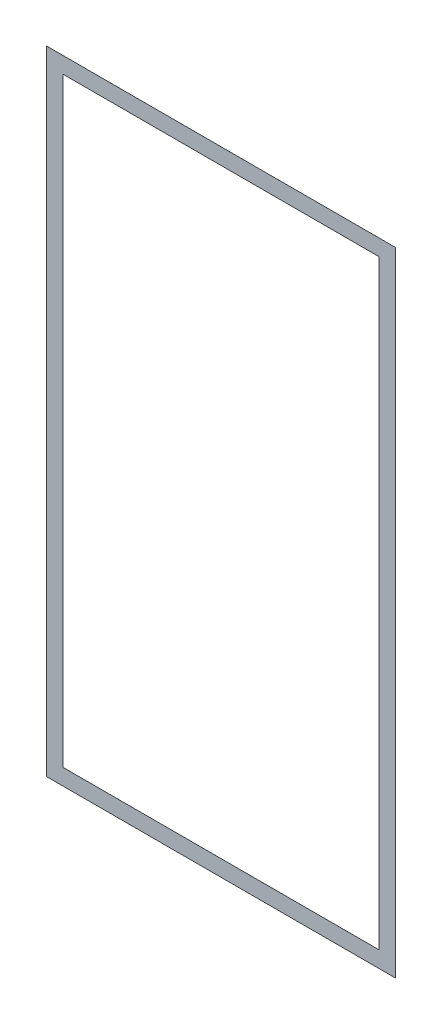
ISO-10303-21;
HEADER;
FILE_DESCRIPTION(('STEP AP214'),'2;1');
FILE_NAME('part.step','',(''),(''),'','','');
FILE_SCHEMA(('AUTOMOTIVE_DESIGN { 1 0 10303 214 1 1 1 1 }'));
ENDSEC;
DATA;
#1=APPLICATION_CONTEXT('core data for automotive mechanical design processes');
#2=APPLICATION_PROTOCOL_DEFINITION('international standard','automotive_design',2000,#1);
#3=PRODUCT_CONTEXT('',#1,'mechanical');
#4=PRODUCT('Part','Part','',(#3));
#5=PRODUCT_RELATED_PRODUCT_CATEGORY('part','',(#4));
#6=PRODUCT_DEFINITION_FORMATION('','',#4);
#7=PRODUCT_DEFINITION_CONTEXT('part definition',#1,'design');
#8=PRODUCT_DEFINITION('design','',#6,#7);
#9=PRODUCT_DEFINITION_SHAPE('','',#8);
#10=(LENGTH_UNIT() NAMED_UNIT(*) SI_UNIT(.MILLI.,.METRE.));
#11=(NAMED_UNIT(*) PLANE_ANGLE_UNIT() SI_UNIT($,.RADIAN.));
#12=(NAMED_UNIT(*) SI_UNIT($,.STERADIAN.) SOLID_ANGLE_UNIT());
#13=UNCERTAINTY_MEASURE_WITH_UNIT(LENGTH_MEASURE(1.E-05),#10,'distance_accuracy_value','');
#14=(GEOMETRIC_REPRESENTATION_CONTEXT(3) GLOBAL_UNCERTAINTY_ASSIGNED_CONTEXT((#13)) GLOBAL_UNIT_ASSIGNED_CONTEXT((#10,
#11,#12)) REPRESENTATION_CONTEXT('',''));
#15=CARTESIAN_POINT('',(0.,0.,0.));
#16=DIRECTION('',(0.,0.,1.));
#17=DIRECTION('',(1.,0.,0.));
#18=AXIS2_PLACEMENT_3D('',#15,#16,#17);
#19=CARTESIAN_POINT('',(495.299999999995,-1171.575,0.));
#20=DIRECTION('',(1.,0.,0.));
#21=DIRECTION('',(0.,0.,-1.));
#22=AXIS2_PLACEMENT_3D('',#19,#20,#21);
#23=PLANE('',#22);
#24=DIRECTION('',(0.,1.,0.));
#25=VECTOR('',#24,1.);
#26=CARTESIAN_POINT('',(495.299999999995,-1171.575,0.));
#27=LINE('',#26,#25);
#28=CARTESIAN_POINT('',(495.299999999995,-1171.575,0.));
#29=VERTEX_POINT('',#28);
#30=CARTESIAN_POINT('',(495.299999999995,708.024999999997,0.));
#31=VERTEX_POINT('',#30);
#32=EDGE_CURVE('E34',#29,#31,#27,.T.);
#33=ORIENTED_EDGE('',*,*,#32,.F.);
#34=DIRECTION('',(0.,0.,1.));
#35=VECTOR('',#34,1.);
#36=CARTESIAN_POINT('',(495.299999999995,-1171.575,0.));
#37=LINE('',#36,#35);
#38=CARTESIAN_POINT('',(495.299999999995,-1171.575,0.0254));
#39=VERTEX_POINT('',#38);
#40=EDGE_CURVE('E10',#29,#39,#37,.T.);
#41=ORIENTED_EDGE('',*,*,#40,.T.);
#42=DIRECTION('',(0.,-1.,0.));
#43=VECTOR('',#42,1.);
#44=CARTESIAN_POINT('',(495.299999999995,708.024999999997,0.0254));
#45=LINE('',#44,#43);
#46=CARTESIAN_POINT('',(495.299999999995,708.024999999997,0.0254));
#47=VERTEX_POINT('',#46);
#48=EDGE_CURVE('E109',#47,#39,#45,.T.);
#49=ORIENTED_EDGE('',*,*,#48,.F.);
#50=DIRECTION('',(0.,0.,1.));
#51=VECTOR('',#50,1.);
#52=CARTESIAN_POINT('',(495.299999999995,708.024999999997,0.));
#53=LINE('',#52,#51);
#54=EDGE_CURVE('E114',#31,#47,#53,.T.);
#55=ORIENTED_EDGE('',*,*,#54,.F.);
#56=EDGE_LOOP('',(#33,#41,#49,#55));
#57=FACE_BOUND('',#56,.T.);
#58=ADVANCED_FACE('F16',(#57),#23,.F.);
#59=CARTESIAN_POINT('',(-495.299999999995,-1171.575,0.));
#60=DIRECTION('',(0.,-1.,0.));
#61=DIRECTION('',(0.,0.,-1.));
#62=AXIS2_PLACEMENT_3D('',#59,#60,#61);
#63=PLANE('',#62);
#64=DIRECTION('',(1.,0.,0.));
#65=VECTOR('',#64,1.);
#66=CARTESIAN_POINT('',(-495.299999999995,-1171.575,0.));
#67=LINE('',#66,#65);
#68=CARTESIAN_POINT('',(-495.299999999995,-1171.575,0.));
#69=VERTEX_POINT('',#68);
#70=EDGE_CURVE('E172',#69,#29,#67,.T.);
#71=ORIENTED_EDGE('',*,*,#70,.F.);
#72=DIRECTION('',(0.,0.,1.));
#73=VECTOR('',#72,1.);
#74=CARTESIAN_POINT('',(-495.299999999995,-1171.575,0.));
#75=LINE('',#74,#73);
#76=CARTESIAN_POINT('',(-495.299999999995,-1171.575,0.0254));
#77=VERTEX_POINT('',#76);
#78=EDGE_CURVE('E26',#69,#77,#75,.T.);
#79=ORIENTED_EDGE('',*,*,#78,.T.);
#80=DIRECTION('',(-1.,0.,0.));
#81=VECTOR('',#80,1.);
#82=CARTESIAN_POINT('',(495.299999999995,-1171.575,0.0254));
#83=LINE('',#82,#81);
#84=EDGE_CURVE('E176',#39,#77,#83,.T.);
#85=ORIENTED_EDGE('',*,*,#84,.F.);
#86=ORIENTED_EDGE('',*,*,#40,.F.);
#87=EDGE_LOOP('',(#71,#79,#85,#86));
#88=FACE_BOUND('',#87,.T.);
#89=ADVANCED_FACE('F146',(#88),#63,.F.);
#90=CARTESIAN_POINT('',(-495.299999999996,708.024999999997,0.));
#91=DIRECTION('',(-1.,0.,0.));
#92=DIRECTION('',(0.,0.,1.));
#93=AXIS2_PLACEMENT_3D('',#90,#91,#92);
#94=PLANE('',#93);
#95=DIRECTION('',(0.,-1.,0.));
#96=VECTOR('',#95,1.);
#97=CARTESIAN_POINT('',(-495.299999999996,708.024999999997,0.));
#98=LINE('',#97,#96);
#99=CARTESIAN_POINT('',(-495.299999999996,708.024999999997,0.));
#100=VERTEX_POINT('',#99);
#101=EDGE_CURVE('E169',#100,#69,#98,.T.);
#102=ORIENTED_EDGE('',*,*,#101,.F.);
#103=DIRECTION('',(0.,0.,1.));
#104=VECTOR('',#103,1.);
#105=CARTESIAN_POINT('',(-495.299999999996,708.024999999997,0.));
#106=LINE('',#105,#104);
#107=CARTESIAN_POINT('',(-495.299999999996,708.024999999997,0.0254));
#108=VERTEX_POINT('',#107);
#109=EDGE_CURVE('E118',#100,#108,#106,.T.);
#110=ORIENTED_EDGE('',*,*,#109,.T.);
#111=DIRECTION('',(0.,1.,0.));
#112=VECTOR('',#111,1.);
#113=CARTESIAN_POINT('',(-495.299999999995,-1171.575,0.0254));
#114=LINE('',#113,#112);
#115=EDGE_CURVE('E130',#77,#108,#114,.T.);
#116=ORIENTED_EDGE('',*,*,#115,.F.);
#117=ORIENTED_EDGE('',*,*,#78,.F.);
#118=EDGE_LOOP('',(#102,#110,#116,#117));
#119=FACE_BOUND('',#118,.T.);
#120=ADVANCED_FACE('F151',(#119),#94,.F.);
#121=CARTESIAN_POINT('',(495.299999999995,708.024999999997,0.));
#122=DIRECTION('',(0.,1.,0.));
#123=DIRECTION('',(0.,0.,1.));
#124=AXIS2_PLACEMENT_3D('',#121,#122,#123);
#125=PLANE('',#124);
#126=DIRECTION('',(-1.,0.,0.));
#127=VECTOR('',#126,1.);
#128=CARTESIAN_POINT('',(495.299999999995,708.024999999997,0.));
#129=LINE('',#128,#127);
#130=EDGE_CURVE('E165',#31,#100,#129,.T.);
#131=ORIENTED_EDGE('',*,*,#130,.F.);
#132=ORIENTED_EDGE('',*,*,#54,.T.);
#133=DIRECTION('',(1.,0.,0.));
#134=VECTOR('',#133,1.);
#135=CARTESIAN_POINT('',(-495.299999999996,708.024999999997,0.0254));
#136=LINE('',#135,#134);
#137=EDGE_CURVE('E128',#108,#47,#136,.T.);
#138=ORIENTED_EDGE('',*,*,#137,.F.);
#139=ORIENTED_EDGE('',*,*,#109,.F.);
#140=EDGE_LOOP('',(#131,#132,#138,#139));
#141=FACE_BOUND('',#140,.T.);
#142=ADVANCED_FACE('F143',(#141),#125,.F.);
#143=CARTESIAN_POINT('',(546.099999999995,-1222.375,0.));
#144=DIRECTION('',(1.,0.,0.));
#145=DIRECTION('',(0.,0.,-1.));
#146=AXIS2_PLACEMENT_3D('',#143,#144,#145);
#147=PLANE('',#146);
#148=DIRECTION('',(0.,-1.,0.));
#149=VECTOR('',#148,1.);
#150=CARTESIAN_POINT('',(546.099999999995,758.824999999997,0.));
#151=LINE('',#150,#149);
#152=CARTESIAN_POINT('',(546.099999999995,758.824999999997,0.));
#153=VERTEX_POINT('',#152);
#154=CARTESIAN_POINT('',(546.099999999995,-1222.375,0.));
#155=VERTEX_POINT('',#154);
#156=EDGE_CURVE('E113',#153,#155,#151,.T.);
#157=ORIENTED_EDGE('',*,*,#156,.F.);
#158=DIRECTION('',(0.,0.,1.));
#159=VECTOR('',#158,1.);
#160=CARTESIAN_POINT('',(546.099999999995,758.824999999997,0.));
#161=LINE('',#160,#159);
#162=CARTESIAN_POINT('',(546.099999999995,758.824999999997,0.0254));
#163=VERTEX_POINT('',#162);
#164=EDGE_CURVE('E111',#153,#163,#161,.T.);
#165=ORIENTED_EDGE('',*,*,#164,.T.);
#166=DIRECTION('',(0.,1.,0.));
#167=VECTOR('',#166,1.);
#168=CARTESIAN_POINT('',(546.099999999995,-1222.375,0.0254));
#169=LINE('',#168,#167);
#170=CARTESIAN_POINT('',(546.099999999995,-1222.375,0.0254));
#171=VERTEX_POINT('',#170);
#172=EDGE_CURVE('E104',#171,#163,#169,.T.);
#173=ORIENTED_EDGE('',*,*,#172,.F.);
#174=DIRECTION('',(0.,0.,1.));
#175=VECTOR('',#174,1.);
#176=CARTESIAN_POINT('',(546.099999999995,-1222.375,0.));
#177=LINE('',#176,#175);
#178=EDGE_CURVE('E115',#155,#171,#177,.T.);
#179=ORIENTED_EDGE('',*,*,#178,.F.);
#180=EDGE_LOOP('',(#157,#165,#173,#179));
#181=FACE_BOUND('',#180,.T.);
#182=ADVANCED_FACE('F112',(#181),#147,.T.);
#183=CARTESIAN_POINT('',(-546.099999999996,-1222.375,0.));
#184=DIRECTION('',(0.,-1.,0.));
#185=DIRECTION('',(0.,0.,-1.));
#186=AXIS2_PLACEMENT_3D('',#183,#184,#185);
#187=PLANE('',#186);
#188=DIRECTION('',(-1.,0.,0.));
#189=VECTOR('',#188,1.);
#190=CARTESIAN_POINT('',(546.099999999995,-1222.375,0.));
#191=LINE('',#190,#189);
#192=CARTESIAN_POINT('',(-546.099999999996,-1222.375,0.));
#193=VERTEX_POINT('',#192);
#194=EDGE_CURVE('E124',#155,#193,#191,.T.);
#195=ORIENTED_EDGE('',*,*,#194,.F.);
#196=ORIENTED_EDGE('',*,*,#178,.T.);
#197=DIRECTION('',(1.,0.,0.));
#198=VECTOR('',#197,1.);
#199=CARTESIAN_POINT('',(-546.099999999996,-1222.375,0.0254));
#200=LINE('',#199,#198);
#201=CARTESIAN_POINT('',(-546.099999999996,-1222.375,0.0254));
#202=VERTEX_POINT('',#201);
#203=EDGE_CURVE('E94',#202,#171,#200,.T.);
#204=ORIENTED_EDGE('',*,*,#203,.F.);
#205=DIRECTION('',(0.,0.,1.));
#206=VECTOR('',#205,1.);
#207=CARTESIAN_POINT('',(-546.099999999996,-1222.375,0.));
#208=LINE('',#207,#206);
#209=EDGE_CURVE('E90',#193,#202,#208,.T.);
#210=ORIENTED_EDGE('',*,*,#209,.F.);
#211=EDGE_LOOP('',(#195,#196,#204,#210));
#212=FACE_BOUND('',#211,.T.);
#213=ADVANCED_FACE('F134',(#212),#187,.T.);
#214=CARTESIAN_POINT('',(-546.099999999996,758.824999999997,0.));
#215=DIRECTION('',(-1.,0.,0.));
#216=DIRECTION('',(0.,0.,1.));
#217=AXIS2_PLACEMENT_3D('',#214,#215,#216);
#218=PLANE('',#217);
#219=DIRECTION('',(0.,1.,0.));
#220=VECTOR('',#219,1.);
#221=CARTESIAN_POINT('',(-546.099999999996,-1222.375,0.));
#222=LINE('',#221,#220);
#223=CARTESIAN_POINT('',(-546.099999999996,758.824999999997,0.));
#224=VERTEX_POINT('',#223);
#225=EDGE_CURVE('E78',#193,#224,#222,.T.);
#226=ORIENTED_EDGE('',*,*,#225,.F.);
#227=ORIENTED_EDGE('',*,*,#209,.T.);
#228=DIRECTION('',(0.,-1.,0.));
#229=VECTOR('',#228,1.);
#230=CARTESIAN_POINT('',(-546.099999999996,758.824999999997,0.0254));
#231=LINE('',#230,#229);
#232=CARTESIAN_POINT('',(-546.099999999996,758.824999999997,0.0254));
#233=VERTEX_POINT('',#232);
#234=EDGE_CURVE('E84',#233,#202,#231,.T.);
#235=ORIENTED_EDGE('',*,*,#234,.F.);
#236=DIRECTION('',(0.,0.,1.));
#237=VECTOR('',#236,1.);
#238=CARTESIAN_POINT('',(-546.099999999996,758.824999999997,0.));
#239=LINE('',#238,#237);
#240=EDGE_CURVE('E87',#224,#233,#239,.T.);
#241=ORIENTED_EDGE('',*,*,#240,.F.);
#242=EDGE_LOOP('',(#226,#227,#235,#241));
#243=FACE_BOUND('',#242,.T.);
#244=ADVANCED_FACE('F86',(#243),#218,.T.);
#245=CARTESIAN_POINT('',(546.099999999995,758.824999999997,0.));
#246=DIRECTION('',(0.,1.,0.));
#247=DIRECTION('',(0.,0.,1.));
#248=AXIS2_PLACEMENT_3D('',#245,#246,#247);
#249=PLANE('',#248);
#250=DIRECTION('',(1.,0.,0.));
#251=VECTOR('',#250,1.);
#252=CARTESIAN_POINT('',(-546.099999999996,758.824999999997,0.));
#253=LINE('',#252,#251);
#254=EDGE_CURVE('E100',#224,#153,#253,.T.);
#255=ORIENTED_EDGE('',*,*,#254,.F.);
#256=ORIENTED_EDGE('',*,*,#240,.T.);
#257=DIRECTION('',(-1.,0.,0.));
#258=VECTOR('',#257,1.);
#259=CARTESIAN_POINT('',(546.099999999995,758.824999999997,0.0254));
#260=LINE('',#259,#258);
#261=EDGE_CURVE('E20',#163,#233,#260,.T.);
#262=ORIENTED_EDGE('',*,*,#261,.F.);
#263=ORIENTED_EDGE('',*,*,#164,.F.);
#264=EDGE_LOOP('',(#255,#256,#262,#263));
#265=FACE_BOUND('',#264,.T.);
#266=ADVANCED_FACE('F98',(#265),#249,.T.);
#267=CARTESIAN_POINT('',(0.,-231.775000000003,0.0254));
#268=DIRECTION('',(0.,0.,-1.));
#269=DIRECTION('',(-1.,0.,0.));
#270=AXIS2_PLACEMENT_3D('',#267,#268,#269);
#271=PLANE('',#270);
#272=ORIENTED_EDGE('',*,*,#261,.T.);
#273=ORIENTED_EDGE('',*,*,#234,.T.);
#274=ORIENTED_EDGE('',*,*,#203,.T.);
#275=ORIENTED_EDGE('',*,*,#172,.T.);
#276=EDGE_LOOP('',(#272,#273,#274,#275));
#277=FACE_BOUND('',#276,.T.);
#278=ORIENTED_EDGE('',*,*,#48,.T.);
#279=ORIENTED_EDGE('',*,*,#84,.T.);
#280=ORIENTED_EDGE('',*,*,#115,.T.);
#281=ORIENTED_EDGE('',*,*,#137,.T.);
#282=EDGE_LOOP('',(#278,#279,#280,#281));
#283=FACE_BOUND('',#282,.T.);
#284=ADVANCED_FACE('F102',(#277,#283),#271,.F.);
#285=CARTESIAN_POINT('',(0.,-231.775000000003,0.));
#286=DIRECTION('',(0.,0.,-1.));
#287=DIRECTION('',(-1.,0.,0.));
#288=AXIS2_PLACEMENT_3D('',#285,#286,#287);
#289=PLANE('',#288);
#290=ORIENTED_EDGE('',*,*,#254,.T.);
#291=ORIENTED_EDGE('',*,*,#156,.T.);
#292=ORIENTED_EDGE('',*,*,#194,.T.);
#293=ORIENTED_EDGE('',*,*,#225,.T.);
#294=EDGE_LOOP('',(#290,#291,#292,#293));
#295=FACE_BOUND('',#294,.T.);
#296=ORIENTED_EDGE('',*,*,#32,.T.);
#297=ORIENTED_EDGE('',*,*,#130,.T.);
#298=ORIENTED_EDGE('',*,*,#101,.T.);
#299=ORIENTED_EDGE('',*,*,#70,.T.);
#300=EDGE_LOOP('',(#296,#297,#298,#299));
#301=FACE_BOUND('',#300,.T.);
#302=ADVANCED_FACE('F18',(#295,#301),#289,.T.);
#303=CLOSED_SHELL('',(#58,#89,#120,#142,#182,#213,#244,#266,#284,#302));
#304=MANIFOLD_SOLID_BREP('B1',#303);
#305=ADVANCED_BREP_SHAPE_REPRESENTATION('',(#18,#304),#14);
#306=SHAPE_DEFINITION_REPRESENTATION(#9,#305);
ENDSEC;
END-ISO-10303-21;
